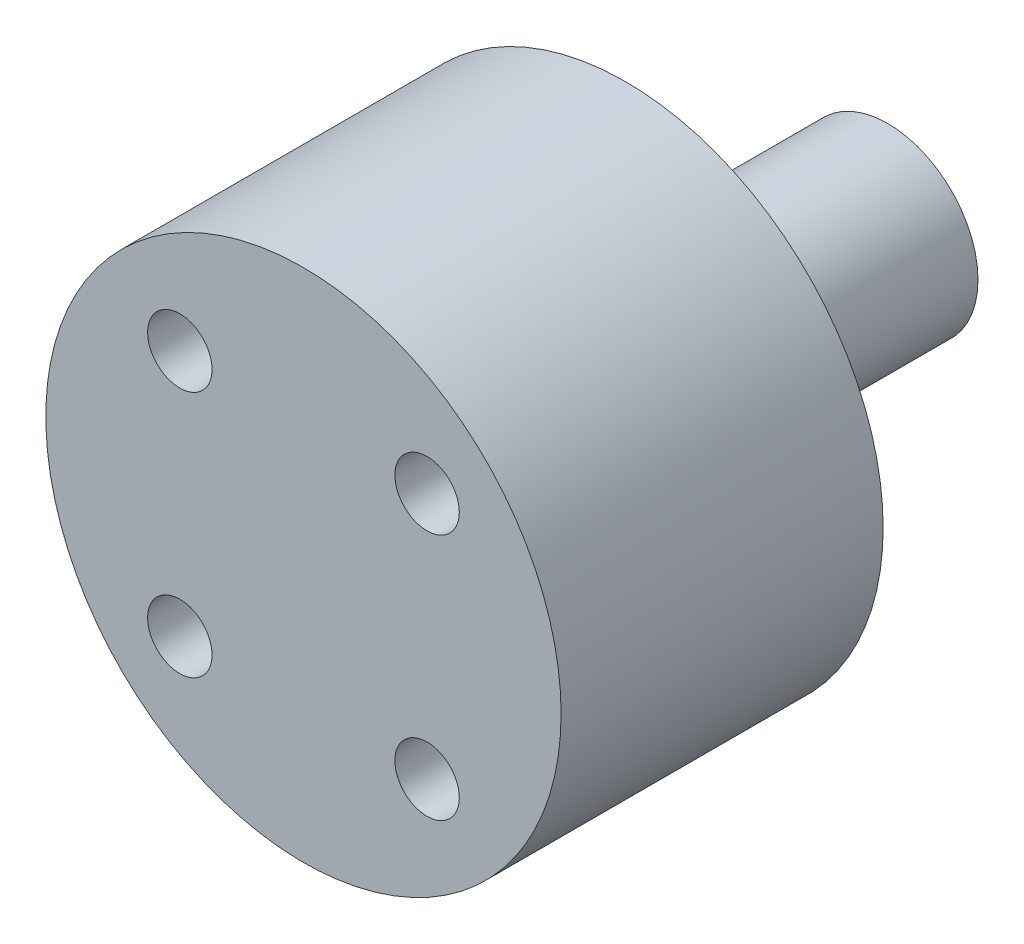
ISO-10303-21;
HEADER;
FILE_DESCRIPTION(('STEP AP214'),'2;1');
FILE_NAME('part.step','',(''),(''),'','','');
FILE_SCHEMA(('AUTOMOTIVE_DESIGN { 1 0 10303 214 1 1 1 1 }'));
ENDSEC;
DATA;
#1=APPLICATION_CONTEXT('core data for automotive mechanical design processes');
#2=APPLICATION_PROTOCOL_DEFINITION('international standard','automotive_design',2000,#1);
#3=PRODUCT_CONTEXT('',#1,'mechanical');
#4=PRODUCT('Part','Part','',(#3));
#5=PRODUCT_RELATED_PRODUCT_CATEGORY('part','',(#4));
#6=PRODUCT_DEFINITION_FORMATION('','',#4);
#7=PRODUCT_DEFINITION_CONTEXT('part definition',#1,'design');
#8=PRODUCT_DEFINITION('design','',#6,#7);
#9=PRODUCT_DEFINITION_SHAPE('','',#8);
#10=(LENGTH_UNIT() NAMED_UNIT(*) SI_UNIT(.MILLI.,.METRE.));
#11=(NAMED_UNIT(*) PLANE_ANGLE_UNIT() SI_UNIT($,.RADIAN.));
#12=(NAMED_UNIT(*) SI_UNIT($,.STERADIAN.) SOLID_ANGLE_UNIT());
#13=UNCERTAINTY_MEASURE_WITH_UNIT(LENGTH_MEASURE(1.E-05),#10,'distance_accuracy_value','');
#14=(GEOMETRIC_REPRESENTATION_CONTEXT(3) GLOBAL_UNCERTAINTY_ASSIGNED_CONTEXT((#13)) GLOBAL_UNIT_ASSIGNED_CONTEXT((#10,
#11,#12)) REPRESENTATION_CONTEXT('',''));
#15=CARTESIAN_POINT('',(0.,0.,0.));
#16=DIRECTION('',(0.,0.,1.));
#17=DIRECTION('',(1.,0.,0.));
#18=AXIS2_PLACEMENT_3D('',#15,#16,#17);
#19=CARTESIAN_POINT('',(0.,0.,17.5));
#20=DIRECTION('',(0.,0.,1.));
#21=DIRECTION('',(1.,0.,0.));
#22=AXIS2_PLACEMENT_3D('',#19,#20,#21);
#23=PLANE('',#22);
#24=CARTESIAN_POINT('',(6.7175144212722,-6.7175144212722,17.5));
#25=DIRECTION('',(0.,0.,1.));
#26=DIRECTION('',(1.,0.,0.));
#27=AXIS2_PLACEMENT_3D('',#24,#25,#26);
#28=CIRCLE('',#27,1.75);
#29=CARTESIAN_POINT('',(8.4675144212722,-6.7175144212722,17.5));
#30=VERTEX_POINT('',#29);
#31=EDGE_CURVE('E78',#30,#30,#28,.T.);
#32=ORIENTED_EDGE('',*,*,#31,.F.);
#33=EDGE_LOOP('',(#32));
#34=FACE_BOUND('',#33,.T.);
#35=CARTESIAN_POINT('',(-6.7175144212722,-6.7175144212722,17.5));
#36=DIRECTION('',(0.,0.,1.));
#37=DIRECTION('',(1.,0.,0.));
#38=AXIS2_PLACEMENT_3D('',#35,#36,#37);
#39=CIRCLE('',#38,1.75);
#40=CARTESIAN_POINT('',(-4.9675144212722,-6.7175144212722,17.5));
#41=VERTEX_POINT('',#40);
#42=EDGE_CURVE('E90',#41,#41,#39,.T.);
#43=ORIENTED_EDGE('',*,*,#42,.F.);
#44=EDGE_LOOP('',(#43));
#45=FACE_BOUND('',#44,.T.);
#46=CARTESIAN_POINT('',(0.,0.,17.5));
#47=DIRECTION('',(0.,0.,1.));
#48=DIRECTION('',(1.,0.,0.));
#49=AXIS2_PLACEMENT_3D('',#46,#47,#48);
#50=CIRCLE('',#49,14.);
#51=CARTESIAN_POINT('',(14.,0.,17.5));
#52=VERTEX_POINT('',#51);
#53=EDGE_CURVE('E63',#52,#52,#50,.T.);
#54=ORIENTED_EDGE('',*,*,#53,.T.);
#55=EDGE_LOOP('',(#54));
#56=FACE_BOUND('',#55,.T.);
#57=CARTESIAN_POINT('',(-6.7175144212722,6.7175144212722,17.5));
#58=DIRECTION('',(0.,0.,1.));
#59=DIRECTION('',(1.,0.,0.));
#60=AXIS2_PLACEMENT_3D('',#57,#58,#59);
#61=CIRCLE('',#60,1.75);
#62=CARTESIAN_POINT('',(-4.9675144212722,6.7175144212722,17.5));
#63=VERTEX_POINT('',#62);
#64=EDGE_CURVE('E84',#63,#63,#61,.T.);
#65=ORIENTED_EDGE('',*,*,#64,.F.);
#66=EDGE_LOOP('',(#65));
#67=FACE_BOUND('',#66,.T.);
#68=CARTESIAN_POINT('',(6.7175144212722,6.7175144212722,17.5));
#69=DIRECTION('',(0.,0.,1.));
#70=DIRECTION('',(1.,0.,0.));
#71=AXIS2_PLACEMENT_3D('',#68,#69,#70);
#72=CIRCLE('',#71,1.75);
#73=CARTESIAN_POINT('',(8.4675144212722,6.7175144212722,17.5));
#74=VERTEX_POINT('',#73);
#75=EDGE_CURVE('E71',#74,#74,#72,.T.);
#76=ORIENTED_EDGE('',*,*,#75,.F.);
#77=EDGE_LOOP('',(#76));
#78=FACE_BOUND('',#77,.T.);
#79=ADVANCED_FACE('F55',(#34,#45,#56,#67,#78),#23,.T.);
#80=CARTESIAN_POINT('',(0.,0.,0.));
#81=DIRECTION('',(0.,0.,1.));
#82=DIRECTION('',(1.,0.,0.));
#83=AXIS2_PLACEMENT_3D('',#80,#81,#82);
#84=PLANE('',#83);
#85=CARTESIAN_POINT('',(0.,0.,0.));
#86=DIRECTION('',(0.,0.,-1.));
#87=DIRECTION('',(-1.,0.,0.));
#88=AXIS2_PLACEMENT_3D('',#85,#86,#87);
#89=CIRCLE('',#88,4.90407781302583);
#90=CARTESIAN_POINT('',(4.90407781302583,0.,0.));
#91=VERTEX_POINT('',#90);
#92=EDGE_CURVE('E11',#91,#91,#89,.T.);
#93=ORIENTED_EDGE('',*,*,#92,.F.);
#94=EDGE_LOOP('',(#93));
#95=FACE_BOUND('',#94,.T.);
#96=CARTESIAN_POINT('',(0.,0.,0.));
#97=DIRECTION('',(0.,0.,1.));
#98=DIRECTION('',(1.,0.,0.));
#99=AXIS2_PLACEMENT_3D('',#96,#97,#98);
#100=CIRCLE('',#99,14.);
#101=CARTESIAN_POINT('',(14.,0.,0.));
#102=VERTEX_POINT('',#101);
#103=EDGE_CURVE('E59',#102,#102,#100,.T.);
#104=ORIENTED_EDGE('',*,*,#103,.F.);
#105=EDGE_LOOP('',(#104));
#106=FACE_BOUND('',#105,.T.);
#107=CARTESIAN_POINT('',(-6.7175144212722,-6.7175144212722,0.));
#108=DIRECTION('',(0.,0.,1.));
#109=DIRECTION('',(1.,0.,0.));
#110=AXIS2_PLACEMENT_3D('',#107,#108,#109);
#111=CIRCLE('',#110,1.75);
#112=CARTESIAN_POINT('',(-4.9675144212722,-6.7175144212722,0.));
#113=VERTEX_POINT('',#112);
#114=EDGE_CURVE('E87',#113,#113,#111,.T.);
#115=ORIENTED_EDGE('',*,*,#114,.T.);
#116=EDGE_LOOP('',(#115));
#117=FACE_BOUND('',#116,.T.);
#118=CARTESIAN_POINT('',(-6.7175144212722,6.7175144212722,0.));
#119=DIRECTION('',(0.,0.,1.));
#120=DIRECTION('',(1.,0.,0.));
#121=AXIS2_PLACEMENT_3D('',#118,#119,#120);
#122=CIRCLE('',#121,1.75);
#123=CARTESIAN_POINT('',(-4.9675144212722,6.7175144212722,0.));
#124=VERTEX_POINT('',#123);
#125=EDGE_CURVE('E81',#124,#124,#122,.T.);
#126=ORIENTED_EDGE('',*,*,#125,.T.);
#127=EDGE_LOOP('',(#126));
#128=FACE_BOUND('',#127,.T.);
#129=CARTESIAN_POINT('',(6.7175144212722,-6.7175144212722,0.));
#130=DIRECTION('',(0.,0.,1.));
#131=DIRECTION('',(1.,0.,0.));
#132=AXIS2_PLACEMENT_3D('',#129,#130,#131);
#133=CIRCLE('',#132,1.75);
#134=CARTESIAN_POINT('',(8.4675144212722,-6.7175144212722,0.));
#135=VERTEX_POINT('',#134);
#136=EDGE_CURVE('E74',#135,#135,#133,.T.);
#137=ORIENTED_EDGE('',*,*,#136,.T.);
#138=EDGE_LOOP('',(#137));
#139=FACE_BOUND('',#138,.T.);
#140=CARTESIAN_POINT('',(6.7175144212722,6.7175144212722,0.));
#141=DIRECTION('',(0.,0.,1.));
#142=DIRECTION('',(1.,0.,0.));
#143=AXIS2_PLACEMENT_3D('',#140,#141,#142);
#144=CIRCLE('',#143,1.75);
#145=CARTESIAN_POINT('',(8.4675144212722,6.7175144212722,0.));
#146=VERTEX_POINT('',#145);
#147=EDGE_CURVE('E75',#146,#146,#144,.T.);
#148=ORIENTED_EDGE('',*,*,#147,.T.);
#149=EDGE_LOOP('',(#148));
#150=FACE_BOUND('',#149,.T.);
#151=ADVANCED_FACE('F96',(#95,#106,#117,#128,#139,#150),#84,.F.);
#152=CARTESIAN_POINT('',(0.,0.,17.5));
#153=DIRECTION('',(0.,0.,-1.));
#154=DIRECTION('',(-1.,0.,0.));
#155=AXIS2_PLACEMENT_3D('',#152,#153,#154);
#156=CYLINDRICAL_SURFACE('',#155,14.);
#157=ORIENTED_EDGE('',*,*,#53,.F.);
#158=EDGE_LOOP('',(#157));
#159=FACE_BOUND('',#158,.T.);
#160=ORIENTED_EDGE('',*,*,#103,.T.);
#161=EDGE_LOOP('',(#160));
#162=FACE_BOUND('',#161,.T.);
#163=ADVANCED_FACE('F57',(#159,#162),#156,.T.);
#164=CARTESIAN_POINT('',(-6.7175144212722,-6.7175144212722,17.5));
#165=DIRECTION('',(0.,0.,-1.));
#166=DIRECTION('',(-1.,0.,0.));
#167=AXIS2_PLACEMENT_3D('',#164,#165,#166);
#168=CYLINDRICAL_SURFACE('',#167,1.75);
#169=ORIENTED_EDGE('',*,*,#42,.T.);
#170=EDGE_LOOP('',(#169));
#171=FACE_BOUND('',#170,.T.);
#172=ORIENTED_EDGE('',*,*,#114,.F.);
#173=EDGE_LOOP('',(#172));
#174=FACE_BOUND('',#173,.T.);
#175=ADVANCED_FACE('F99',(#171,#174),#168,.F.);
#176=CARTESIAN_POINT('',(-6.7175144212722,6.7175144212722,17.5));
#177=DIRECTION('',(0.,0.,-1.));
#178=DIRECTION('',(-1.,0.,0.));
#179=AXIS2_PLACEMENT_3D('',#176,#177,#178);
#180=CYLINDRICAL_SURFACE('',#179,1.75);
#181=ORIENTED_EDGE('',*,*,#64,.T.);
#182=EDGE_LOOP('',(#181));
#183=FACE_BOUND('',#182,.T.);
#184=ORIENTED_EDGE('',*,*,#125,.F.);
#185=EDGE_LOOP('',(#184));
#186=FACE_BOUND('',#185,.T.);
#187=ADVANCED_FACE('F101',(#183,#186),#180,.F.);
#188=CARTESIAN_POINT('',(6.7175144212722,-6.7175144212722,17.5));
#189=DIRECTION('',(0.,0.,-1.));
#190=DIRECTION('',(-1.,0.,0.));
#191=AXIS2_PLACEMENT_3D('',#188,#189,#190);
#192=CYLINDRICAL_SURFACE('',#191,1.75);
#193=ORIENTED_EDGE('',*,*,#31,.T.);
#194=EDGE_LOOP('',(#193));
#195=FACE_BOUND('',#194,.T.);
#196=ORIENTED_EDGE('',*,*,#136,.F.);
#197=EDGE_LOOP('',(#196));
#198=FACE_BOUND('',#197,.T.);
#199=ADVANCED_FACE('F108',(#195,#198),#192,.F.);
#200=CARTESIAN_POINT('',(6.7175144212722,6.7175144212722,17.5));
#201=DIRECTION('',(0.,0.,-1.));
#202=DIRECTION('',(-1.,0.,0.));
#203=AXIS2_PLACEMENT_3D('',#200,#201,#202);
#204=CYLINDRICAL_SURFACE('',#203,1.75);
#205=ORIENTED_EDGE('',*,*,#75,.T.);
#206=EDGE_LOOP('',(#205));
#207=FACE_BOUND('',#206,.T.);
#208=ORIENTED_EDGE('',*,*,#147,.F.);
#209=EDGE_LOOP('',(#208));
#210=FACE_BOUND('',#209,.T.);
#211=ADVANCED_FACE('F129',(#207,#210),#204,.F.);
#212=CARTESIAN_POINT('',(0.,0.,-14.25));
#213=DIRECTION('',(0.,0.,1.));
#214=DIRECTION('',(1.,0.,0.));
#215=AXIS2_PLACEMENT_3D('',#212,#213,#214);
#216=CYLINDRICAL_SURFACE('',#215,4.90407781302583);
#217=CARTESIAN_POINT('',(0.,0.,-14.25));
#218=DIRECTION('',(0.,0.,-1.));
#219=DIRECTION('',(-1.,0.,0.));
#220=AXIS2_PLACEMENT_3D('',#217,#218,#219);
#221=CIRCLE('',#220,4.90407781302583);
#222=CARTESIAN_POINT('',(4.90407781302583,0.,-14.25));
#223=VERTEX_POINT('',#222);
#224=EDGE_CURVE('E70',#223,#223,#221,.T.);
#225=CARTESIAN_POINT('',(4.90407781302583,0.,-14.25));
#226=CARTESIAN_POINT('',(4.90407781302583,0.,-14.1015625));
#227=CARTESIAN_POINT('',(4.90407781302583,0.,-13.953125));
#228=CARTESIAN_POINT('',(4.90407781302583,0.,-13.65625));
#229=CARTESIAN_POINT('',(4.90407781302583,0.,-13.5078125));
#230=CARTESIAN_POINT('',(4.90407781302583,0.,-13.2109375));
#231=CARTESIAN_POINT('',(4.90407781302583,0.,-13.0625));
#232=CARTESIAN_POINT('',(4.90407781302583,0.,-12.765625));
#233=CARTESIAN_POINT('',(4.90407781302583,0.,-12.6171875));
#234=CARTESIAN_POINT('',(4.90407781302583,0.,-12.3203125));
#235=CARTESIAN_POINT('',(4.90407781302583,0.,-12.171875));
#236=CARTESIAN_POINT('',(4.90407781302583,0.,-11.875));
#237=CARTESIAN_POINT('',(4.90407781302583,0.,-11.7265625));
#238=CARTESIAN_POINT('',(4.90407781302583,0.,-11.4296875));
#239=CARTESIAN_POINT('',(4.90407781302583,0.,-11.28125));
#240=CARTESIAN_POINT('',(4.90407781302583,0.,-10.984375));
#241=CARTESIAN_POINT('',(4.90407781302583,0.,-10.8359375));
#242=CARTESIAN_POINT('',(4.90407781302583,0.,-10.5390625));
#243=CARTESIAN_POINT('',(4.90407781302583,0.,-10.390625));
#244=CARTESIAN_POINT('',(4.90407781302583,0.,-10.09375));
#245=CARTESIAN_POINT('',(4.90407781302583,0.,-9.9453125));
#246=CARTESIAN_POINT('',(4.90407781302583,0.,-9.6484375));
#247=CARTESIAN_POINT('',(4.90407781302583,0.,-9.5));
#248=CARTESIAN_POINT('',(4.90407781302583,0.,-9.203125));
#249=CARTESIAN_POINT('',(4.90407781302583,0.,-9.0546875));
#250=CARTESIAN_POINT('',(4.90407781302583,0.,-8.7578125));
#251=CARTESIAN_POINT('',(4.90407781302583,0.,-8.609375));
#252=CARTESIAN_POINT('',(4.90407781302583,0.,-8.3125));
#253=CARTESIAN_POINT('',(4.90407781302583,0.,-8.1640625));
#254=CARTESIAN_POINT('',(4.90407781302583,0.,-7.8671875));
#255=CARTESIAN_POINT('',(4.90407781302583,0.,-7.71875));
#256=CARTESIAN_POINT('',(4.90407781302583,0.,-7.421875));
#257=CARTESIAN_POINT('',(4.90407781302583,0.,-7.2734375));
#258=CARTESIAN_POINT('',(4.90407781302583,0.,-6.9765625));
#259=CARTESIAN_POINT('',(4.90407781302583,0.,-6.828125));
#260=CARTESIAN_POINT('',(4.90407781302583,0.,-6.53125));
#261=CARTESIAN_POINT('',(4.90407781302583,0.,-6.3828125));
#262=CARTESIAN_POINT('',(4.90407781302583,0.,-6.0859375));
#263=CARTESIAN_POINT('',(4.90407781302583,0.,-5.9375));
#264=CARTESIAN_POINT('',(4.90407781302583,0.,-5.640625));
#265=CARTESIAN_POINT('',(4.90407781302583,0.,-5.4921875));
#266=CARTESIAN_POINT('',(4.90407781302583,0.,-5.1953125));
#267=CARTESIAN_POINT('',(4.90407781302583,0.,-5.046875));
#268=CARTESIAN_POINT('',(4.90407781302583,0.,-4.75));
#269=CARTESIAN_POINT('',(4.90407781302583,0.,-4.6015625));
#270=CARTESIAN_POINT('',(4.90407781302583,0.,-4.3046875));
#271=CARTESIAN_POINT('',(4.90407781302583,0.,-4.15625));
#272=CARTESIAN_POINT('',(4.90407781302583,0.,-3.859375));
#273=CARTESIAN_POINT('',(4.90407781302583,0.,-3.7109375));
#274=CARTESIAN_POINT('',(4.90407781302583,0.,-3.4140625));
#275=CARTESIAN_POINT('',(4.90407781302583,0.,-3.265625));
#276=CARTESIAN_POINT('',(4.90407781302583,0.,-2.96875));
#277=CARTESIAN_POINT('',(4.90407781302583,0.,-2.8203125));
#278=CARTESIAN_POINT('',(4.90407781302583,0.,-2.5234375));
#279=CARTESIAN_POINT('',(4.90407781302583,0.,-2.375));
#280=CARTESIAN_POINT('',(4.90407781302583,0.,-2.078125));
#281=CARTESIAN_POINT('',(4.90407781302583,0.,-1.9296875));
#282=CARTESIAN_POINT('',(4.90407781302583,0.,-1.6328125));
#283=CARTESIAN_POINT('',(4.90407781302583,0.,-1.484375));
#284=CARTESIAN_POINT('',(4.90407781302583,0.,-1.1875));
#285=CARTESIAN_POINT('',(4.90407781302583,0.,-1.0390625));
#286=CARTESIAN_POINT('',(4.90407781302583,0.,-0.7421875));
#287=CARTESIAN_POINT('',(4.90407781302583,0.,-0.59375));
#288=CARTESIAN_POINT('',(4.90407781302583,0.,-0.296875));
#289=CARTESIAN_POINT('',(4.90407781302583,0.,-0.1484375));
#290=CARTESIAN_POINT('',(4.90407781302583,0.,0.));
#291=B_SPLINE_CURVE_WITH_KNOTS('',3,(#225,#226,#227,#228,#229,#230,#231,#232,#233,#234,#235,
#236,#237,#238,#239,#240,#241,#242,#243,#244,#245,#246,#247,#248,#249,#250,#251,#252,#253,#254,
#255,#256,#257,#258,#259,#260,#261,#262,#263,#264,#265,#266,#267,#268,#269,#270,#271,#272,#273,
#274,#275,#276,#277,#278,#279,#280,#281,#282,#283,#284,#285,#286,#287,#288,#289,#290),
.UNSPECIFIED.,.F.,.F.,(4,2,2,2,2,2,2,2,2,2,2,2,2,2,2,2,2,2,2,2,2,2,2,2,2,2,2,2,2,2,2,2,4),(0.,
0.445312500000001,0.890625000000001,1.3359375,1.78125,2.2265625,2.671875,3.1171875,3.5625,
4.0078125,4.453125,4.8984375,5.34375,5.7890625,6.234375,6.6796875,7.125,7.5703125,8.015625,
8.4609375,8.90625,9.3515625,9.796875,10.2421875,10.6875,11.1328125,11.578125,12.0234375,
12.46875,12.9140625,13.359375,13.8046875,14.25),.UNSPECIFIED.);
#292=EDGE_CURVE('BSEAM132',#223,#91,#291,.T.);
#293=ORIENTED_EDGE('',*,*,#224,.F.);
#294=ORIENTED_EDGE('',*,*,#92,.T.);
#295=ORIENTED_EDGE('',*,*,#292,.T.);
#296=ORIENTED_EDGE('',*,*,#292,.F.);
#297=EDGE_LOOP('',(#293,#295,#294,#296));
#298=FACE_BOUND('',#297,.T.);
#299=ADVANCED_FACE('F132',(#298),#216,.T.);
#300=CARTESIAN_POINT('',(0.,0.,-14.25));
#301=DIRECTION('',(0.,0.,-1.));
#302=DIRECTION('',(-1.,0.,0.));
#303=AXIS2_PLACEMENT_3D('',#300,#301,#302);
#304=PLANE('',#303);
#305=ORIENTED_EDGE('',*,*,#224,.T.);
#306=EDGE_LOOP('',(#305));
#307=FACE_BOUND('',#306,.T.);
#308=ADVANCED_FACE('F140',(#307),#304,.T.);
#309=CLOSED_SHELL('',(#79,#151,#163,#175,#187,#199,#211,#299,#308));
#310=MANIFOLD_SOLID_BREP('B2',#309);
#311=ADVANCED_BREP_SHAPE_REPRESENTATION('',(#18,#310),#14);
#312=SHAPE_DEFINITION_REPRESENTATION(#9,#311);
ENDSEC;
END-ISO-10303-21;
